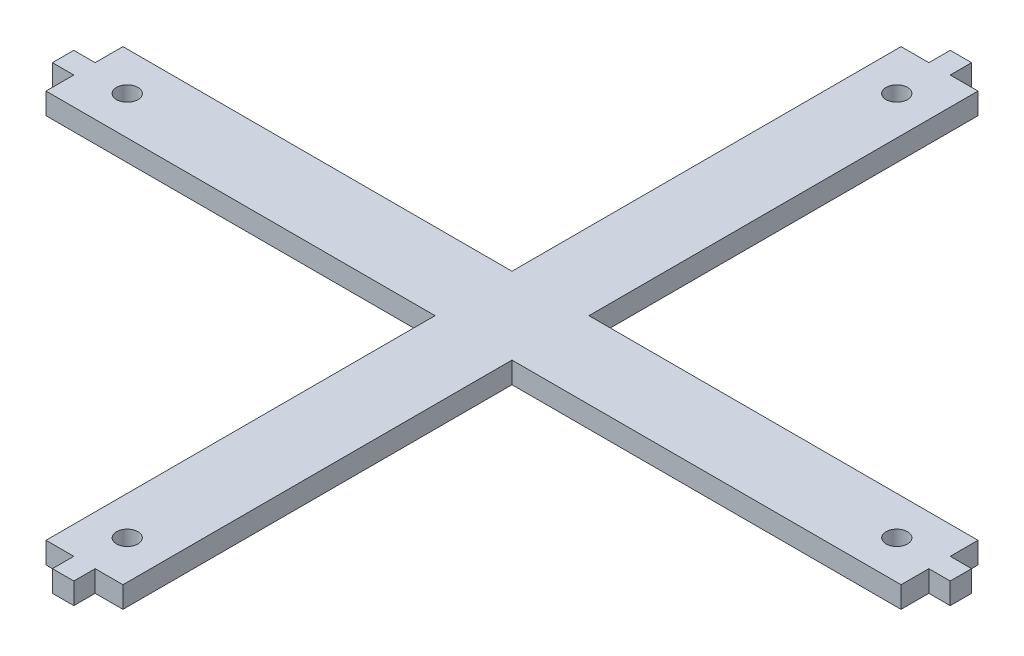
ISO-10303-21;
HEADER;
FILE_DESCRIPTION(('STEP AP214'),'2;1');
FILE_NAME('part.step','',(''),(''),'','','');
FILE_SCHEMA(('AUTOMOTIVE_DESIGN { 1 0 10303 214 1 1 1 1 }'));
ENDSEC;
DATA;
#1=APPLICATION_CONTEXT('core data for automotive mechanical design processes');
#2=APPLICATION_PROTOCOL_DEFINITION('international standard','automotive_design',2000,#1);
#3=PRODUCT_CONTEXT('',#1,'mechanical');
#4=PRODUCT('Part','Part','',(#3));
#5=PRODUCT_RELATED_PRODUCT_CATEGORY('part','',(#4));
#6=PRODUCT_DEFINITION_FORMATION('','',#4);
#7=PRODUCT_DEFINITION_CONTEXT('part definition',#1,'design');
#8=PRODUCT_DEFINITION('design','',#6,#7);
#9=PRODUCT_DEFINITION_SHAPE('','',#8);
#10=(LENGTH_UNIT() NAMED_UNIT(*) SI_UNIT(.MILLI.,.METRE.));
#11=(NAMED_UNIT(*) PLANE_ANGLE_UNIT() SI_UNIT($,.RADIAN.));
#12=(NAMED_UNIT(*) SI_UNIT($,.STERADIAN.) SOLID_ANGLE_UNIT());
#13=UNCERTAINTY_MEASURE_WITH_UNIT(LENGTH_MEASURE(1.E-05),#10,'distance_accuracy_value','');
#14=(GEOMETRIC_REPRESENTATION_CONTEXT(3) GLOBAL_UNCERTAINTY_ASSIGNED_CONTEXT((#13)) GLOBAL_UNIT_ASSIGNED_CONTEXT((#10,
#11,#12)) REPRESENTATION_CONTEXT('',''));
#15=CARTESIAN_POINT('',(0.,0.,0.));
#16=DIRECTION('',(0.,0.,1.));
#17=DIRECTION('',(1.,0.,0.));
#18=AXIS2_PLACEMENT_3D('',#15,#16,#17);
#19=CARTESIAN_POINT('',(0.,6.35,0.));
#20=DIRECTION('',(0.,1.,0.));
#21=DIRECTION('',(0.,0.,1.));
#22=AXIS2_PLACEMENT_3D('',#19,#20,#21);
#23=PLANE('',#22);
#24=CARTESIAN_POINT('',(0.,6.35,-114.3));
#25=DIRECTION('',(0.,1.,0.));
#26=DIRECTION('',(0.,0.,1.));
#27=AXIS2_PLACEMENT_3D('',#24,#25,#26);
#28=CIRCLE('',#27,3.175);
#29=CARTESIAN_POINT('',(0.,6.35,-111.125));
#30=VERTEX_POINT('',#29);
#31=EDGE_CURVE('E501',#30,#30,#28,.T.);
#32=ORIENTED_EDGE('',*,*,#31,.F.);
#33=EDGE_LOOP('',(#32));
#34=FACE_BOUND('',#33,.T.);
#35=CARTESIAN_POINT('',(-114.3,6.35,0.));
#36=DIRECTION('',(0.,1.,0.));
#37=DIRECTION('',(0.,0.,1.));
#38=AXIS2_PLACEMENT_3D('',#35,#36,#37);
#39=CIRCLE('',#38,3.175);
#40=CARTESIAN_POINT('',(-114.3,6.35,3.175));
#41=VERTEX_POINT('',#40);
#42=EDGE_CURVE('E256',#41,#41,#39,.T.);
#43=ORIENTED_EDGE('',*,*,#42,.F.);
#44=EDGE_LOOP('',(#43));
#45=FACE_BOUND('',#44,.T.);
#46=DIRECTION('',(0.,0.,-1.));
#47=VECTOR('',#46,1.);
#48=CARTESIAN_POINT('',(127.,6.35,3.175));
#49=LINE('',#48,#47);
#50=CARTESIAN_POINT('',(127.,6.35,11.43));
#51=VERTEX_POINT('',#50);
#52=CARTESIAN_POINT('',(127.,6.35,3.175));
#53=VERTEX_POINT('',#52);
#54=EDGE_CURVE('E307',#51,#53,#49,.T.);
#55=ORIENTED_EDGE('',*,*,#54,.T.);
#56=DIRECTION('',(1.,0.,0.));
#57=VECTOR('',#56,1.);
#58=CARTESIAN_POINT('',(127.,6.35,3.175));
#59=LINE('',#58,#57);
#60=CARTESIAN_POINT('',(133.35,6.35,3.175));
#61=VERTEX_POINT('',#60);
#62=EDGE_CURVE('E155',#53,#61,#59,.T.);
#63=ORIENTED_EDGE('',*,*,#62,.T.);
#64=DIRECTION('',(0.,0.,-1.));
#65=VECTOR('',#64,1.);
#66=CARTESIAN_POINT('',(133.35,6.35,-3.175));
#67=LINE('',#66,#65);
#68=CARTESIAN_POINT('',(133.35,6.35,-3.175));
#69=VERTEX_POINT('',#68);
#70=EDGE_CURVE('E382',#61,#69,#67,.T.);
#71=ORIENTED_EDGE('',*,*,#70,.T.);
#72=DIRECTION('',(-1.,0.,0.));
#73=VECTOR('',#72,1.);
#74=CARTESIAN_POINT('',(127.,6.35,-3.175));
#75=LINE('',#74,#73);
#76=CARTESIAN_POINT('',(127.,6.35,-3.175));
#77=VERTEX_POINT('',#76);
#78=EDGE_CURVE('E401',#69,#77,#75,.T.);
#79=ORIENTED_EDGE('',*,*,#78,.T.);
#80=DIRECTION('',(0.,0.,-1.));
#81=VECTOR('',#80,1.);
#82=CARTESIAN_POINT('',(127.,6.35,-11.43));
#83=LINE('',#82,#81);
#84=CARTESIAN_POINT('',(127.,6.35,-11.43));
#85=VERTEX_POINT('',#84);
#86=EDGE_CURVE('E398',#77,#85,#83,.T.);
#87=ORIENTED_EDGE('',*,*,#86,.T.);
#88=DIRECTION('',(-1.,0.,0.));
#89=VECTOR('',#88,1.);
#90=CARTESIAN_POINT('',(11.43,6.35,-11.43));
#91=LINE('',#90,#89);
#92=CARTESIAN_POINT('',(11.43,6.35,-11.43));
#93=VERTEX_POINT('',#92);
#94=EDGE_CURVE('E400',#85,#93,#91,.T.);
#95=ORIENTED_EDGE('',*,*,#94,.T.);
#96=DIRECTION('',(0.,0.,-1.));
#97=VECTOR('',#96,1.);
#98=CARTESIAN_POINT('',(11.43,6.35,-127.));
#99=LINE('',#98,#97);
#100=CARTESIAN_POINT('',(11.43,6.35,-127.));
#101=VERTEX_POINT('',#100);
#102=EDGE_CURVE('E403',#93,#101,#99,.T.);
#103=ORIENTED_EDGE('',*,*,#102,.T.);
#104=DIRECTION('',(-1.,0.,0.));
#105=VECTOR('',#104,1.);
#106=CARTESIAN_POINT('',(3.17499999999998,6.35,-127.));
#107=LINE('',#106,#105);
#108=CARTESIAN_POINT('',(3.17499999999998,6.35,-127.));
#109=VERTEX_POINT('',#108);
#110=EDGE_CURVE('E409',#101,#109,#107,.T.);
#111=ORIENTED_EDGE('',*,*,#110,.T.);
#112=DIRECTION('',(0.,0.,-1.));
#113=VECTOR('',#112,1.);
#114=CARTESIAN_POINT('',(3.17499999999998,6.35,-127.));
#115=LINE('',#114,#113);
#116=CARTESIAN_POINT('',(3.17499999999998,6.35,-133.35));
#117=VERTEX_POINT('',#116);
#118=EDGE_CURVE('E411',#109,#117,#115,.T.);
#119=ORIENTED_EDGE('',*,*,#118,.T.);
#120=DIRECTION('',(-1.,0.,0.));
#121=VECTOR('',#120,1.);
#122=CARTESIAN_POINT('',(-3.17500000000002,6.35,-133.35));
#123=LINE('',#122,#121);
#124=CARTESIAN_POINT('',(-3.17500000000002,6.35,-133.35));
#125=VERTEX_POINT('',#124);
#126=EDGE_CURVE('E413',#117,#125,#123,.T.);
#127=ORIENTED_EDGE('',*,*,#126,.T.);
#128=DIRECTION('',(0.,0.,1.));
#129=VECTOR('',#128,1.);
#130=CARTESIAN_POINT('',(-3.17500000000002,6.35,-127.));
#131=LINE('',#130,#129);
#132=CARTESIAN_POINT('',(-3.17500000000002,6.35,-127.));
#133=VERTEX_POINT('',#132);
#134=EDGE_CURVE('E415',#125,#133,#131,.T.);
#135=ORIENTED_EDGE('',*,*,#134,.T.);
#136=DIRECTION('',(-1.,0.,0.));
#137=VECTOR('',#136,1.);
#138=CARTESIAN_POINT('',(-11.43,6.35,-127.));
#139=LINE('',#138,#137);
#140=CARTESIAN_POINT('',(-11.43,6.35,-127.));
#141=VERTEX_POINT('',#140);
#142=EDGE_CURVE('E417',#133,#141,#139,.T.);
#143=ORIENTED_EDGE('',*,*,#142,.T.);
#144=DIRECTION('',(0.,0.,1.));
#145=VECTOR('',#144,1.);
#146=CARTESIAN_POINT('',(-11.43,6.35,-127.));
#147=LINE('',#146,#145);
#148=CARTESIAN_POINT('',(-11.43,6.35,-11.43));
#149=VERTEX_POINT('',#148);
#150=EDGE_CURVE('E419',#141,#149,#147,.T.);
#151=ORIENTED_EDGE('',*,*,#150,.T.);
#152=DIRECTION('',(-1.,0.,0.));
#153=VECTOR('',#152,1.);
#154=CARTESIAN_POINT('',(-127.,6.35,-11.43));
#155=LINE('',#154,#153);
#156=CARTESIAN_POINT('',(-127.,6.35,-11.43));
#157=VERTEX_POINT('',#156);
#158=EDGE_CURVE('E421',#149,#157,#155,.T.);
#159=ORIENTED_EDGE('',*,*,#158,.T.);
#160=DIRECTION('',(0.,0.,1.));
#161=VECTOR('',#160,1.);
#162=CARTESIAN_POINT('',(-127.,6.35,-11.43));
#163=LINE('',#162,#161);
#164=CARTESIAN_POINT('',(-127.,6.35,-3.175));
#165=VERTEX_POINT('',#164);
#166=EDGE_CURVE('E423',#157,#165,#163,.T.);
#167=ORIENTED_EDGE('',*,*,#166,.T.);
#168=DIRECTION('',(-1.,0.,0.));
#169=VECTOR('',#168,1.);
#170=CARTESIAN_POINT('',(-133.35,6.35,-3.175));
#171=LINE('',#170,#169);
#172=CARTESIAN_POINT('',(-133.35,6.35,-3.175));
#173=VERTEX_POINT('',#172);
#174=EDGE_CURVE('E425',#165,#173,#171,.T.);
#175=ORIENTED_EDGE('',*,*,#174,.T.);
#176=DIRECTION('',(0.,0.,1.));
#177=VECTOR('',#176,1.);
#178=CARTESIAN_POINT('',(-133.35,6.35,-3.175));
#179=LINE('',#178,#177);
#180=CARTESIAN_POINT('',(-133.35,6.35,3.175));
#181=VERTEX_POINT('',#180);
#182=EDGE_CURVE('E427',#173,#181,#179,.T.);
#183=ORIENTED_EDGE('',*,*,#182,.T.);
#184=DIRECTION('',(1.,0.,0.));
#185=VECTOR('',#184,1.);
#186=CARTESIAN_POINT('',(-133.35,6.35,3.175));
#187=LINE('',#186,#185);
#188=CARTESIAN_POINT('',(-127.,6.35,3.175));
#189=VERTEX_POINT('',#188);
#190=EDGE_CURVE('E429',#181,#189,#187,.T.);
#191=ORIENTED_EDGE('',*,*,#190,.T.);
#192=DIRECTION('',(0.,0.,1.));
#193=VECTOR('',#192,1.);
#194=CARTESIAN_POINT('',(-127.,6.35,3.175));
#195=LINE('',#194,#193);
#196=CARTESIAN_POINT('',(-127.,6.35,11.43));
#197=VERTEX_POINT('',#196);
#198=EDGE_CURVE('E431',#189,#197,#195,.T.);
#199=ORIENTED_EDGE('',*,*,#198,.T.);
#200=DIRECTION('',(1.,0.,0.));
#201=VECTOR('',#200,1.);
#202=CARTESIAN_POINT('',(-127.,6.35,11.43));
#203=LINE('',#202,#201);
#204=CARTESIAN_POINT('',(-11.43,6.35,11.43));
#205=VERTEX_POINT('',#204);
#206=EDGE_CURVE('E433',#197,#205,#203,.T.);
#207=ORIENTED_EDGE('',*,*,#206,.T.);
#208=DIRECTION('',(0.,0.,1.));
#209=VECTOR('',#208,1.);
#210=CARTESIAN_POINT('',(-11.43,6.35,11.43));
#211=LINE('',#210,#209);
#212=CARTESIAN_POINT('',(-11.43,6.35,127.));
#213=VERTEX_POINT('',#212);
#214=EDGE_CURVE('E435',#205,#213,#211,.T.);
#215=ORIENTED_EDGE('',*,*,#214,.T.);
#216=DIRECTION('',(1.,0.,0.));
#217=VECTOR('',#216,1.);
#218=CARTESIAN_POINT('',(-11.43,6.35,127.));
#219=LINE('',#218,#217);
#220=CARTESIAN_POINT('',(-3.17499999999995,6.35,127.));
#221=VERTEX_POINT('',#220);
#222=EDGE_CURVE('E437',#213,#221,#219,.T.);
#223=ORIENTED_EDGE('',*,*,#222,.T.);
#224=DIRECTION('',(0.,0.,1.));
#225=VECTOR('',#224,1.);
#226=CARTESIAN_POINT('',(-3.17499999999995,6.35,127.));
#227=LINE('',#226,#225);
#228=CARTESIAN_POINT('',(-3.17499999999995,6.35,133.35));
#229=VERTEX_POINT('',#228);
#230=EDGE_CURVE('E439',#221,#229,#227,.T.);
#231=ORIENTED_EDGE('',*,*,#230,.T.);
#232=DIRECTION('',(1.,0.,0.));
#233=VECTOR('',#232,1.);
#234=CARTESIAN_POINT('',(-3.17499999999995,6.35,133.35));
#235=LINE('',#234,#233);
#236=CARTESIAN_POINT('',(3.17500000000005,6.35,133.35));
#237=VERTEX_POINT('',#236);
#238=EDGE_CURVE('E441',#229,#237,#235,.T.);
#239=ORIENTED_EDGE('',*,*,#238,.T.);
#240=DIRECTION('',(0.,0.,-1.));
#241=VECTOR('',#240,1.);
#242=CARTESIAN_POINT('',(3.17500000000005,6.35,127.));
#243=LINE('',#242,#241);
#244=CARTESIAN_POINT('',(3.17500000000005,6.35,127.));
#245=VERTEX_POINT('',#244);
#246=EDGE_CURVE('E234',#237,#245,#243,.T.);
#247=ORIENTED_EDGE('',*,*,#246,.T.);
#248=DIRECTION('',(1.,0.,0.));
#249=VECTOR('',#248,1.);
#250=CARTESIAN_POINT('',(3.17500000000005,6.35,127.));
#251=LINE('',#250,#249);
#252=CARTESIAN_POINT('',(11.43,6.35,127.));
#253=VERTEX_POINT('',#252);
#254=EDGE_CURVE('E228',#245,#253,#251,.T.);
#255=ORIENTED_EDGE('',*,*,#254,.T.);
#256=DIRECTION('',(0.,0.,-1.));
#257=VECTOR('',#256,1.);
#258=CARTESIAN_POINT('',(11.43,6.35,11.43));
#259=LINE('',#258,#257);
#260=CARTESIAN_POINT('',(11.43,6.35,11.43));
#261=VERTEX_POINT('',#260);
#262=EDGE_CURVE('E232',#253,#261,#259,.T.);
#263=ORIENTED_EDGE('',*,*,#262,.T.);
#264=DIRECTION('',(1.,0.,0.));
#265=VECTOR('',#264,1.);
#266=CARTESIAN_POINT('',(11.43,6.35,11.43));
#267=LINE('',#266,#265);
#268=EDGE_CURVE('E52',#261,#51,#267,.T.);
#269=ORIENTED_EDGE('',*,*,#268,.T.);
#270=EDGE_LOOP('',(#55,#63,#71,#79,#87,#95,#103,#111,#119,#127,#135,#143,#151,#159,#167,#175,
#183,#191,#199,#207,#215,#223,#231,#239,#247,#255,#263,#269));
#271=FACE_BOUND('',#270,.T.);
#272=CARTESIAN_POINT('',(114.3,6.35,0.));
#273=DIRECTION('',(0.,1.,0.));
#274=DIRECTION('',(0.,0.,1.));
#275=AXIS2_PLACEMENT_3D('',#272,#273,#274);
#276=CIRCLE('',#275,3.175);
#277=CARTESIAN_POINT('',(114.3,6.35,3.17499999999999));
#278=VERTEX_POINT('',#277);
#279=EDGE_CURVE('E507',#278,#278,#276,.T.);
#280=ORIENTED_EDGE('',*,*,#279,.F.);
#281=EDGE_LOOP('',(#280));
#282=FACE_BOUND('',#281,.T.);
#283=CARTESIAN_POINT('',(0.,6.35,114.3));
#284=DIRECTION('',(0.,1.,0.));
#285=DIRECTION('',(0.,0.,1.));
#286=AXIS2_PLACEMENT_3D('',#283,#284,#285);
#287=CIRCLE('',#286,3.175);
#288=CARTESIAN_POINT('',(0.,6.35,117.475));
#289=VERTEX_POINT('',#288);
#290=EDGE_CURVE('E492',#289,#289,#287,.T.);
#291=ORIENTED_EDGE('',*,*,#290,.F.);
#292=EDGE_LOOP('',(#291));
#293=FACE_BOUND('',#292,.T.);
#294=ADVANCED_FACE('F35',(#34,#45,#271,#282,#293),#23,.T.);
#295=CARTESIAN_POINT('',(0.,0.,0.));
#296=DIRECTION('',(0.,1.,0.));
#297=DIRECTION('',(0.,0.,1.));
#298=AXIS2_PLACEMENT_3D('',#295,#296,#297);
#299=PLANE('',#298);
#300=DIRECTION('',(0.,0.,-1.));
#301=VECTOR('',#300,1.);
#302=CARTESIAN_POINT('',(127.,0.,3.175));
#303=LINE('',#302,#301);
#304=CARTESIAN_POINT('',(127.,0.,11.43));
#305=VERTEX_POINT('',#304);
#306=CARTESIAN_POINT('',(127.,0.,3.175));
#307=VERTEX_POINT('',#306);
#308=EDGE_CURVE('E252',#305,#307,#303,.T.);
#309=ORIENTED_EDGE('',*,*,#308,.F.);
#310=DIRECTION('',(1.,0.,0.));
#311=VECTOR('',#310,1.);
#312=CARTESIAN_POINT('',(11.43,0.,11.43));
#313=LINE('',#312,#311);
#314=CARTESIAN_POINT('',(11.43,0.,11.43));
#315=VERTEX_POINT('',#314);
#316=EDGE_CURVE('E147',#315,#305,#313,.T.);
#317=ORIENTED_EDGE('',*,*,#316,.F.);
#318=DIRECTION('',(0.,0.,-1.));
#319=VECTOR('',#318,1.);
#320=CARTESIAN_POINT('',(11.43,0.,11.43));
#321=LINE('',#320,#319);
#322=CARTESIAN_POINT('',(11.43,0.,127.));
#323=VERTEX_POINT('',#322);
#324=EDGE_CURVE('E141',#323,#315,#321,.T.);
#325=ORIENTED_EDGE('',*,*,#324,.F.);
#326=DIRECTION('',(1.,0.,0.));
#327=VECTOR('',#326,1.);
#328=CARTESIAN_POINT('',(3.17500000000005,0.,127.));
#329=LINE('',#328,#327);
#330=CARTESIAN_POINT('',(3.17500000000005,0.,127.));
#331=VERTEX_POINT('',#330);
#332=EDGE_CURVE('E242',#331,#323,#329,.T.);
#333=ORIENTED_EDGE('',*,*,#332,.F.);
#334=DIRECTION('',(0.,0.,-1.));
#335=VECTOR('',#334,1.);
#336=CARTESIAN_POINT('',(3.17500000000005,0.,127.));
#337=LINE('',#336,#335);
#338=CARTESIAN_POINT('',(3.17500000000005,0.,133.35));
#339=VERTEX_POINT('',#338);
#340=EDGE_CURVE('E302',#339,#331,#337,.T.);
#341=ORIENTED_EDGE('',*,*,#340,.F.);
#342=DIRECTION('',(1.,0.,0.));
#343=VECTOR('',#342,1.);
#344=CARTESIAN_POINT('',(-3.17499999999995,0.,133.35));
#345=LINE('',#344,#343);
#346=CARTESIAN_POINT('',(-3.17499999999995,0.,133.35));
#347=VERTEX_POINT('',#346);
#348=EDGE_CURVE('E300',#347,#339,#345,.T.);
#349=ORIENTED_EDGE('',*,*,#348,.F.);
#350=DIRECTION('',(0.,0.,1.));
#351=VECTOR('',#350,1.);
#352=CARTESIAN_POINT('',(-3.17499999999995,0.,127.));
#353=LINE('',#352,#351);
#354=CARTESIAN_POINT('',(-3.17499999999995,0.,127.));
#355=VERTEX_POINT('',#354);
#356=EDGE_CURVE('E298',#355,#347,#353,.T.);
#357=ORIENTED_EDGE('',*,*,#356,.F.);
#358=DIRECTION('',(1.,0.,0.));
#359=VECTOR('',#358,1.);
#360=CARTESIAN_POINT('',(-11.43,0.,127.));
#361=LINE('',#360,#359);
#362=CARTESIAN_POINT('',(-11.43,0.,127.));
#363=VERTEX_POINT('',#362);
#364=EDGE_CURVE('E296',#363,#355,#361,.T.);
#365=ORIENTED_EDGE('',*,*,#364,.F.);
#366=DIRECTION('',(0.,0.,1.));
#367=VECTOR('',#366,1.);
#368=CARTESIAN_POINT('',(-11.43,0.,11.43));
#369=LINE('',#368,#367);
#370=CARTESIAN_POINT('',(-11.43,0.,11.43));
#371=VERTEX_POINT('',#370);
#372=EDGE_CURVE('E294',#371,#363,#369,.T.);
#373=ORIENTED_EDGE('',*,*,#372,.F.);
#374=DIRECTION('',(1.,0.,0.));
#375=VECTOR('',#374,1.);
#376=CARTESIAN_POINT('',(-127.,0.,11.43));
#377=LINE('',#376,#375);
#378=CARTESIAN_POINT('',(-127.,0.,11.43));
#379=VERTEX_POINT('',#378);
#380=EDGE_CURVE('E292',#379,#371,#377,.T.);
#381=ORIENTED_EDGE('',*,*,#380,.F.);
#382=DIRECTION('',(0.,0.,1.));
#383=VECTOR('',#382,1.);
#384=CARTESIAN_POINT('',(-127.,0.,3.175));
#385=LINE('',#384,#383);
#386=CARTESIAN_POINT('',(-127.,0.,3.175));
#387=VERTEX_POINT('',#386);
#388=EDGE_CURVE('E290',#387,#379,#385,.T.);
#389=ORIENTED_EDGE('',*,*,#388,.F.);
#390=DIRECTION('',(1.,0.,0.));
#391=VECTOR('',#390,1.);
#392=CARTESIAN_POINT('',(-133.35,0.,3.175));
#393=LINE('',#392,#391);
#394=CARTESIAN_POINT('',(-133.35,0.,3.175));
#395=VERTEX_POINT('',#394);
#396=EDGE_CURVE('E288',#395,#387,#393,.T.);
#397=ORIENTED_EDGE('',*,*,#396,.F.);
#398=DIRECTION('',(0.,0.,1.));
#399=VECTOR('',#398,1.);
#400=CARTESIAN_POINT('',(-133.35,0.,-3.175));
#401=LINE('',#400,#399);
#402=CARTESIAN_POINT('',(-133.35,0.,-3.175));
#403=VERTEX_POINT('',#402);
#404=EDGE_CURVE('E286',#403,#395,#401,.T.);
#405=ORIENTED_EDGE('',*,*,#404,.F.);
#406=DIRECTION('',(-1.,0.,0.));
#407=VECTOR('',#406,1.);
#408=CARTESIAN_POINT('',(-133.35,0.,-3.175));
#409=LINE('',#408,#407);
#410=CARTESIAN_POINT('',(-127.,0.,-3.175));
#411=VERTEX_POINT('',#410);
#412=EDGE_CURVE('E284',#411,#403,#409,.T.);
#413=ORIENTED_EDGE('',*,*,#412,.F.);
#414=DIRECTION('',(0.,0.,1.));
#415=VECTOR('',#414,1.);
#416=CARTESIAN_POINT('',(-127.,0.,-11.43));
#417=LINE('',#416,#415);
#418=CARTESIAN_POINT('',(-127.,0.,-11.43));
#419=VERTEX_POINT('',#418);
#420=EDGE_CURVE('E282',#419,#411,#417,.T.);
#421=ORIENTED_EDGE('',*,*,#420,.F.);
#422=DIRECTION('',(-1.,0.,0.));
#423=VECTOR('',#422,1.);
#424=CARTESIAN_POINT('',(-127.,0.,-11.43));
#425=LINE('',#424,#423);
#426=CARTESIAN_POINT('',(-11.43,0.,-11.43));
#427=VERTEX_POINT('',#426);
#428=EDGE_CURVE('E280',#427,#419,#425,.T.);
#429=ORIENTED_EDGE('',*,*,#428,.F.);
#430=DIRECTION('',(0.,0.,1.));
#431=VECTOR('',#430,1.);
#432=CARTESIAN_POINT('',(-11.43,0.,-127.));
#433=LINE('',#432,#431);
#434=CARTESIAN_POINT('',(-11.43,0.,-127.));
#435=VERTEX_POINT('',#434);
#436=EDGE_CURVE('E278',#435,#427,#433,.T.);
#437=ORIENTED_EDGE('',*,*,#436,.F.);
#438=DIRECTION('',(-1.,0.,0.));
#439=VECTOR('',#438,1.);
#440=CARTESIAN_POINT('',(-11.43,0.,-127.));
#441=LINE('',#440,#439);
#442=CARTESIAN_POINT('',(-3.17500000000002,0.,-127.));
#443=VERTEX_POINT('',#442);
#444=EDGE_CURVE('E276',#443,#435,#441,.T.);
#445=ORIENTED_EDGE('',*,*,#444,.F.);
#446=DIRECTION('',(0.,0.,1.));
#447=VECTOR('',#446,1.);
#448=CARTESIAN_POINT('',(-3.17500000000002,0.,-127.));
#449=LINE('',#448,#447);
#450=CARTESIAN_POINT('',(-3.17500000000002,0.,-133.35));
#451=VERTEX_POINT('',#450);
#452=EDGE_CURVE('E274',#451,#443,#449,.T.);
#453=ORIENTED_EDGE('',*,*,#452,.F.);
#454=DIRECTION('',(-1.,0.,0.));
#455=VECTOR('',#454,1.);
#456=CARTESIAN_POINT('',(-3.17500000000002,0.,-133.35));
#457=LINE('',#456,#455);
#458=CARTESIAN_POINT('',(3.17499999999998,0.,-133.35));
#459=VERTEX_POINT('',#458);
#460=EDGE_CURVE('E272',#459,#451,#457,.T.);
#461=ORIENTED_EDGE('',*,*,#460,.F.);
#462=DIRECTION('',(0.,0.,-1.));
#463=VECTOR('',#462,1.);
#464=CARTESIAN_POINT('',(3.17499999999998,0.,-127.));
#465=LINE('',#464,#463);
#466=CARTESIAN_POINT('',(3.17499999999998,0.,-127.));
#467=VERTEX_POINT('',#466);
#468=EDGE_CURVE('E270',#467,#459,#465,.T.);
#469=ORIENTED_EDGE('',*,*,#468,.F.);
#470=DIRECTION('',(-1.,0.,0.));
#471=VECTOR('',#470,1.);
#472=CARTESIAN_POINT('',(3.17499999999998,0.,-127.));
#473=LINE('',#472,#471);
#474=CARTESIAN_POINT('',(11.43,0.,-127.));
#475=VERTEX_POINT('',#474);
#476=EDGE_CURVE('E268',#475,#467,#473,.T.);
#477=ORIENTED_EDGE('',*,*,#476,.F.);
#478=DIRECTION('',(0.,0.,-1.));
#479=VECTOR('',#478,1.);
#480=CARTESIAN_POINT('',(11.43,0.,-127.));
#481=LINE('',#480,#479);
#482=CARTESIAN_POINT('',(11.43,0.,-11.43));
#483=VERTEX_POINT('',#482);
#484=EDGE_CURVE('E266',#483,#475,#481,.T.);
#485=ORIENTED_EDGE('',*,*,#484,.F.);
#486=DIRECTION('',(-1.,0.,0.));
#487=VECTOR('',#486,1.);
#488=CARTESIAN_POINT('',(11.43,0.,-11.43));
#489=LINE('',#488,#487);
#490=CARTESIAN_POINT('',(127.,0.,-11.43));
#491=VERTEX_POINT('',#490);
#492=EDGE_CURVE('E264',#491,#483,#489,.T.);
#493=ORIENTED_EDGE('',*,*,#492,.F.);
#494=DIRECTION('',(0.,0.,-1.));
#495=VECTOR('',#494,1.);
#496=CARTESIAN_POINT('',(127.,0.,-11.43));
#497=LINE('',#496,#495);
#498=CARTESIAN_POINT('',(127.,0.,-3.175));
#499=VERTEX_POINT('',#498);
#500=EDGE_CURVE('E262',#499,#491,#497,.T.);
#501=ORIENTED_EDGE('',*,*,#500,.F.);
#502=DIRECTION('',(-1.,0.,0.));
#503=VECTOR('',#502,1.);
#504=CARTESIAN_POINT('',(127.,0.,-3.175));
#505=LINE('',#504,#503);
#506=CARTESIAN_POINT('',(133.35,0.,-3.175));
#507=VERTEX_POINT('',#506);
#508=EDGE_CURVE('E260',#507,#499,#505,.T.);
#509=ORIENTED_EDGE('',*,*,#508,.F.);
#510=DIRECTION('',(0.,0.,-1.));
#511=VECTOR('',#510,1.);
#512=CARTESIAN_POINT('',(133.35,0.,-3.175));
#513=LINE('',#512,#511);
#514=CARTESIAN_POINT('',(133.35,0.,3.175));
#515=VERTEX_POINT('',#514);
#516=EDGE_CURVE('E258',#515,#507,#513,.T.);
#517=ORIENTED_EDGE('',*,*,#516,.F.);
#518=DIRECTION('',(1.,0.,0.));
#519=VECTOR('',#518,1.);
#520=CARTESIAN_POINT('',(127.,0.,3.175));
#521=LINE('',#520,#519);
#522=EDGE_CURVE('E255',#307,#515,#521,.T.);
#523=ORIENTED_EDGE('',*,*,#522,.F.);
#524=EDGE_LOOP('',(#309,#317,#325,#333,#341,#349,#357,#365,#373,#381,#389,#397,#405,#413,#421,
#429,#437,#445,#453,#461,#469,#477,#485,#493,#501,#509,#517,#523));
#525=FACE_BOUND('',#524,.T.);
#526=CARTESIAN_POINT('',(-114.3,0.,0.));
#527=DIRECTION('',(0.,1.,0.));
#528=DIRECTION('',(0.,0.,1.));
#529=AXIS2_PLACEMENT_3D('',#526,#527,#528);
#530=CIRCLE('',#529,3.175);
#531=CARTESIAN_POINT('',(-114.3,0.,3.175));
#532=VERTEX_POINT('',#531);
#533=EDGE_CURVE('E510',#532,#532,#530,.T.);
#534=ORIENTED_EDGE('',*,*,#533,.T.);
#535=EDGE_LOOP('',(#534));
#536=FACE_BOUND('',#535,.T.);
#537=CARTESIAN_POINT('',(114.3,0.,0.));
#538=DIRECTION('',(0.,1.,0.));
#539=DIRECTION('',(0.,0.,1.));
#540=AXIS2_PLACEMENT_3D('',#537,#538,#539);
#541=CIRCLE('',#540,3.175);
#542=CARTESIAN_POINT('',(114.3,0.,3.17499999999999));
#543=VERTEX_POINT('',#542);
#544=EDGE_CURVE('E504',#543,#543,#541,.T.);
#545=ORIENTED_EDGE('',*,*,#544,.T.);
#546=EDGE_LOOP('',(#545));
#547=FACE_BOUND('',#546,.T.);
#548=CARTESIAN_POINT('',(0.,0.,-114.3));
#549=DIRECTION('',(0.,1.,0.));
#550=DIRECTION('',(0.,0.,1.));
#551=AXIS2_PLACEMENT_3D('',#548,#549,#550);
#552=CIRCLE('',#551,3.175);
#553=CARTESIAN_POINT('',(0.,0.,-111.125));
#554=VERTEX_POINT('',#553);
#555=EDGE_CURVE('E498',#554,#554,#552,.T.);
#556=ORIENTED_EDGE('',*,*,#555,.T.);
#557=EDGE_LOOP('',(#556));
#558=FACE_BOUND('',#557,.T.);
#559=CARTESIAN_POINT('',(0.,0.,114.3));
#560=DIRECTION('',(0.,1.,0.));
#561=DIRECTION('',(0.,0.,1.));
#562=AXIS2_PLACEMENT_3D('',#559,#560,#561);
#563=CIRCLE('',#562,3.175);
#564=CARTESIAN_POINT('',(0.,0.,117.475));
#565=VERTEX_POINT('',#564);
#566=EDGE_CURVE('E495',#565,#565,#563,.T.);
#567=ORIENTED_EDGE('',*,*,#566,.T.);
#568=EDGE_LOOP('',(#567));
#569=FACE_BOUND('',#568,.T.);
#570=ADVANCED_FACE('F386',(#525,#536,#547,#558,#569),#299,.F.);
#571=CARTESIAN_POINT('',(127.,6.35,3.175));
#572=DIRECTION('',(-1.,0.,0.));
#573=DIRECTION('',(0.,0.,1.));
#574=AXIS2_PLACEMENT_3D('',#571,#572,#573);
#575=PLANE('',#574);
#576=ORIENTED_EDGE('',*,*,#308,.T.);
#577=DIRECTION('',(0.,-1.,0.));
#578=VECTOR('',#577,1.);
#579=CARTESIAN_POINT('',(127.,6.35,3.175));
#580=LINE('',#579,#578);
#581=EDGE_CURVE('E11',#53,#307,#580,.T.);
#582=ORIENTED_EDGE('',*,*,#581,.F.);
#583=ORIENTED_EDGE('',*,*,#54,.F.);
#584=DIRECTION('',(0.,-1.,0.));
#585=VECTOR('',#584,1.);
#586=CARTESIAN_POINT('',(127.,6.35,11.43));
#587=LINE('',#586,#585);
#588=EDGE_CURVE('E248',#51,#305,#587,.T.);
#589=ORIENTED_EDGE('',*,*,#588,.T.);
#590=EDGE_LOOP('',(#576,#582,#583,#589));
#591=FACE_BOUND('',#590,.T.);
#592=ADVANCED_FACE('F37',(#591),#575,.F.);
#593=CARTESIAN_POINT('',(127.,6.35,3.175));
#594=DIRECTION('',(0.,0.,-1.));
#595=DIRECTION('',(-1.,0.,0.));
#596=AXIS2_PLACEMENT_3D('',#593,#594,#595);
#597=PLANE('',#596);
#598=ORIENTED_EDGE('',*,*,#522,.T.);
#599=DIRECTION('',(0.,-1.,0.));
#600=VECTOR('',#599,1.);
#601=CARTESIAN_POINT('',(133.35,6.35,3.175));
#602=LINE('',#601,#600);
#603=EDGE_CURVE('E44',#61,#515,#602,.T.);
#604=ORIENTED_EDGE('',*,*,#603,.F.);
#605=ORIENTED_EDGE('',*,*,#62,.F.);
#606=ORIENTED_EDGE('',*,*,#581,.T.);
#607=EDGE_LOOP('',(#598,#604,#605,#606));
#608=FACE_BOUND('',#607,.T.);
#609=ADVANCED_FACE('F780',(#608),#597,.F.);
#610=CARTESIAN_POINT('',(133.35,6.35,-3.175));
#611=DIRECTION('',(-1.,0.,0.));
#612=DIRECTION('',(0.,0.,1.));
#613=AXIS2_PLACEMENT_3D('',#610,#611,#612);
#614=PLANE('',#613);
#615=ORIENTED_EDGE('',*,*,#516,.T.);
#616=DIRECTION('',(0.,-1.,0.));
#617=VECTOR('',#616,1.);
#618=CARTESIAN_POINT('',(133.35,6.35,-3.175));
#619=LINE('',#618,#617);
#620=EDGE_CURVE('E374',#69,#507,#619,.T.);
#621=ORIENTED_EDGE('',*,*,#620,.F.);
#622=ORIENTED_EDGE('',*,*,#70,.F.);
#623=ORIENTED_EDGE('',*,*,#603,.T.);
#624=EDGE_LOOP('',(#615,#621,#622,#623));
#625=FACE_BOUND('',#624,.T.);
#626=ADVANCED_FACE('F380',(#625),#614,.F.);
#627=CARTESIAN_POINT('',(127.,6.35,-3.175));
#628=DIRECTION('',(0.,0.,1.));
#629=DIRECTION('',(1.,0.,0.));
#630=AXIS2_PLACEMENT_3D('',#627,#628,#629);
#631=PLANE('',#630);
#632=ORIENTED_EDGE('',*,*,#508,.T.);
#633=DIRECTION('',(0.,-1.,0.));
#634=VECTOR('',#633,1.);
#635=CARTESIAN_POINT('',(127.,6.35,-3.175));
#636=LINE('',#635,#634);
#637=EDGE_CURVE('E371',#77,#499,#636,.T.);
#638=ORIENTED_EDGE('',*,*,#637,.F.);
#639=ORIENTED_EDGE('',*,*,#78,.F.);
#640=ORIENTED_EDGE('',*,*,#620,.T.);
#641=EDGE_LOOP('',(#632,#638,#639,#640));
#642=FACE_BOUND('',#641,.T.);
#643=ADVANCED_FACE('F392',(#642),#631,.F.);
#644=CARTESIAN_POINT('',(127.,6.35,-11.43));
#645=DIRECTION('',(-1.,0.,0.));
#646=DIRECTION('',(0.,0.,1.));
#647=AXIS2_PLACEMENT_3D('',#644,#645,#646);
#648=PLANE('',#647);
#649=ORIENTED_EDGE('',*,*,#500,.T.);
#650=DIRECTION('',(0.,-1.,0.));
#651=VECTOR('',#650,1.);
#652=CARTESIAN_POINT('',(127.,6.35,-11.43));
#653=LINE('',#652,#651);
#654=EDGE_CURVE('E368',#85,#491,#653,.T.);
#655=ORIENTED_EDGE('',*,*,#654,.F.);
#656=ORIENTED_EDGE('',*,*,#86,.F.);
#657=ORIENTED_EDGE('',*,*,#637,.T.);
#658=EDGE_LOOP('',(#649,#655,#656,#657));
#659=FACE_BOUND('',#658,.T.);
#660=ADVANCED_FACE('F396',(#659),#648,.F.);
#661=CARTESIAN_POINT('',(11.43,6.35,-11.43));
#662=DIRECTION('',(0.,0.,1.));
#663=DIRECTION('',(1.,0.,0.));
#664=AXIS2_PLACEMENT_3D('',#661,#662,#663);
#665=PLANE('',#664);
#666=ORIENTED_EDGE('',*,*,#492,.T.);
#667=DIRECTION('',(0.,-1.,0.));
#668=VECTOR('',#667,1.);
#669=CARTESIAN_POINT('',(11.43,6.35,-11.43));
#670=LINE('',#669,#668);
#671=EDGE_CURVE('E365',#93,#483,#670,.T.);
#672=ORIENTED_EDGE('',*,*,#671,.F.);
#673=ORIENTED_EDGE('',*,*,#94,.F.);
#674=ORIENTED_EDGE('',*,*,#654,.T.);
#675=EDGE_LOOP('',(#666,#672,#673,#674));
#676=FACE_BOUND('',#675,.T.);
#677=ADVANCED_FACE('F745',(#676),#665,.F.);
#678=CARTESIAN_POINT('',(11.43,6.35,-127.));
#679=DIRECTION('',(-1.,0.,0.));
#680=DIRECTION('',(0.,0.,1.));
#681=AXIS2_PLACEMENT_3D('',#678,#679,#680);
#682=PLANE('',#681);
#683=ORIENTED_EDGE('',*,*,#484,.T.);
#684=DIRECTION('',(0.,-1.,0.));
#685=VECTOR('',#684,1.);
#686=CARTESIAN_POINT('',(11.43,6.35,-127.));
#687=LINE('',#686,#685);
#688=EDGE_CURVE('E362',#101,#475,#687,.T.);
#689=ORIENTED_EDGE('',*,*,#688,.F.);
#690=ORIENTED_EDGE('',*,*,#102,.F.);
#691=ORIENTED_EDGE('',*,*,#671,.T.);
#692=EDGE_LOOP('',(#683,#689,#690,#691));
#693=FACE_BOUND('',#692,.T.);
#694=ADVANCED_FACE('F735',(#693),#682,.F.);
#695=CARTESIAN_POINT('',(3.17499999999998,6.35,-127.));
#696=DIRECTION('',(0.,0.,1.));
#697=DIRECTION('',(1.,0.,0.));
#698=AXIS2_PLACEMENT_3D('',#695,#696,#697);
#699=PLANE('',#698);
#700=ORIENTED_EDGE('',*,*,#476,.T.);
#701=DIRECTION('',(0.,-1.,0.));
#702=VECTOR('',#701,1.);
#703=CARTESIAN_POINT('',(3.17499999999998,6.35,-127.));
#704=LINE('',#703,#702);
#705=EDGE_CURVE('E359',#109,#467,#704,.T.);
#706=ORIENTED_EDGE('',*,*,#705,.F.);
#707=ORIENTED_EDGE('',*,*,#110,.F.);
#708=ORIENTED_EDGE('',*,*,#688,.T.);
#709=EDGE_LOOP('',(#700,#706,#707,#708));
#710=FACE_BOUND('',#709,.T.);
#711=ADVANCED_FACE('F725',(#710),#699,.F.);
#712=CARTESIAN_POINT('',(3.17499999999998,6.35,-127.));
#713=DIRECTION('',(-1.,0.,0.));
#714=DIRECTION('',(0.,0.,1.));
#715=AXIS2_PLACEMENT_3D('',#712,#713,#714);
#716=PLANE('',#715);
#717=ORIENTED_EDGE('',*,*,#468,.T.);
#718=DIRECTION('',(0.,-1.,0.));
#719=VECTOR('',#718,1.);
#720=CARTESIAN_POINT('',(3.17499999999998,6.35,-133.35));
#721=LINE('',#720,#719);
#722=EDGE_CURVE('E356',#117,#459,#721,.T.);
#723=ORIENTED_EDGE('',*,*,#722,.F.);
#724=ORIENTED_EDGE('',*,*,#118,.F.);
#725=ORIENTED_EDGE('',*,*,#705,.T.);
#726=EDGE_LOOP('',(#717,#723,#724,#725));
#727=FACE_BOUND('',#726,.T.);
#728=ADVANCED_FACE('F715',(#727),#716,.F.);
#729=CARTESIAN_POINT('',(-3.17500000000002,6.35,-133.35));
#730=DIRECTION('',(0.,0.,1.));
#731=DIRECTION('',(1.,0.,0.));
#732=AXIS2_PLACEMENT_3D('',#729,#730,#731);
#733=PLANE('',#732);
#734=ORIENTED_EDGE('',*,*,#460,.T.);
#735=DIRECTION('',(0.,-1.,0.));
#736=VECTOR('',#735,1.);
#737=CARTESIAN_POINT('',(-3.17500000000002,6.35,-133.35));
#738=LINE('',#737,#736);
#739=EDGE_CURVE('E353',#125,#451,#738,.T.);
#740=ORIENTED_EDGE('',*,*,#739,.F.);
#741=ORIENTED_EDGE('',*,*,#126,.F.);
#742=ORIENTED_EDGE('',*,*,#722,.T.);
#743=EDGE_LOOP('',(#734,#740,#741,#742));
#744=FACE_BOUND('',#743,.T.);
#745=ADVANCED_FACE('F705',(#744),#733,.F.);
#746=CARTESIAN_POINT('',(-3.17500000000002,6.35,-127.));
#747=DIRECTION('',(1.,0.,0.));
#748=DIRECTION('',(0.,0.,-1.));
#749=AXIS2_PLACEMENT_3D('',#746,#747,#748);
#750=PLANE('',#749);
#751=ORIENTED_EDGE('',*,*,#452,.T.);
#752=DIRECTION('',(0.,-1.,0.));
#753=VECTOR('',#752,1.);
#754=CARTESIAN_POINT('',(-3.17500000000002,6.35,-127.));
#755=LINE('',#754,#753);
#756=EDGE_CURVE('E350',#133,#443,#755,.T.);
#757=ORIENTED_EDGE('',*,*,#756,.F.);
#758=ORIENTED_EDGE('',*,*,#134,.F.);
#759=ORIENTED_EDGE('',*,*,#739,.T.);
#760=EDGE_LOOP('',(#751,#757,#758,#759));
#761=FACE_BOUND('',#760,.T.);
#762=ADVANCED_FACE('F695',(#761),#750,.F.);
#763=CARTESIAN_POINT('',(-11.43,6.35,-127.));
#764=DIRECTION('',(0.,0.,1.));
#765=DIRECTION('',(1.,0.,0.));
#766=AXIS2_PLACEMENT_3D('',#763,#764,#765);
#767=PLANE('',#766);
#768=ORIENTED_EDGE('',*,*,#444,.T.);
#769=DIRECTION('',(0.,-1.,0.));
#770=VECTOR('',#769,1.);
#771=CARTESIAN_POINT('',(-11.43,6.35,-127.));
#772=LINE('',#771,#770);
#773=EDGE_CURVE('E347',#141,#435,#772,.T.);
#774=ORIENTED_EDGE('',*,*,#773,.F.);
#775=ORIENTED_EDGE('',*,*,#142,.F.);
#776=ORIENTED_EDGE('',*,*,#756,.T.);
#777=EDGE_LOOP('',(#768,#774,#775,#776));
#778=FACE_BOUND('',#777,.T.);
#779=ADVANCED_FACE('F685',(#778),#767,.F.);
#780=CARTESIAN_POINT('',(-11.43,6.35,-127.));
#781=DIRECTION('',(1.,0.,0.));
#782=DIRECTION('',(0.,0.,-1.));
#783=AXIS2_PLACEMENT_3D('',#780,#781,#782);
#784=PLANE('',#783);
#785=ORIENTED_EDGE('',*,*,#436,.T.);
#786=DIRECTION('',(0.,-1.,0.));
#787=VECTOR('',#786,1.);
#788=CARTESIAN_POINT('',(-11.43,6.35,-11.43));
#789=LINE('',#788,#787);
#790=EDGE_CURVE('E344',#149,#427,#789,.T.);
#791=ORIENTED_EDGE('',*,*,#790,.F.);
#792=ORIENTED_EDGE('',*,*,#150,.F.);
#793=ORIENTED_EDGE('',*,*,#773,.T.);
#794=EDGE_LOOP('',(#785,#791,#792,#793));
#795=FACE_BOUND('',#794,.T.);
#796=ADVANCED_FACE('F675',(#795),#784,.F.);
#797=CARTESIAN_POINT('',(-127.,6.35,-11.43));
#798=DIRECTION('',(0.,0.,1.));
#799=DIRECTION('',(1.,0.,0.));
#800=AXIS2_PLACEMENT_3D('',#797,#798,#799);
#801=PLANE('',#800);
#802=ORIENTED_EDGE('',*,*,#428,.T.);
#803=DIRECTION('',(0.,-1.,0.));
#804=VECTOR('',#803,1.);
#805=CARTESIAN_POINT('',(-127.,6.35,-11.43));
#806=LINE('',#805,#804);
#807=EDGE_CURVE('E341',#157,#419,#806,.T.);
#808=ORIENTED_EDGE('',*,*,#807,.F.);
#809=ORIENTED_EDGE('',*,*,#158,.F.);
#810=ORIENTED_EDGE('',*,*,#790,.T.);
#811=EDGE_LOOP('',(#802,#808,#809,#810));
#812=FACE_BOUND('',#811,.T.);
#813=ADVANCED_FACE('F665',(#812),#801,.F.);
#814=CARTESIAN_POINT('',(-127.,6.35,-11.43));
#815=DIRECTION('',(1.,0.,0.));
#816=DIRECTION('',(0.,0.,-1.));
#817=AXIS2_PLACEMENT_3D('',#814,#815,#816);
#818=PLANE('',#817);
#819=ORIENTED_EDGE('',*,*,#420,.T.);
#820=DIRECTION('',(0.,-1.,0.));
#821=VECTOR('',#820,1.);
#822=CARTESIAN_POINT('',(-127.,6.35,-3.175));
#823=LINE('',#822,#821);
#824=EDGE_CURVE('E338',#165,#411,#823,.T.);
#825=ORIENTED_EDGE('',*,*,#824,.F.);
#826=ORIENTED_EDGE('',*,*,#166,.F.);
#827=ORIENTED_EDGE('',*,*,#807,.T.);
#828=EDGE_LOOP('',(#819,#825,#826,#827));
#829=FACE_BOUND('',#828,.T.);
#830=ADVANCED_FACE('F655',(#829),#818,.F.);
#831=CARTESIAN_POINT('',(-133.35,6.35,-3.175));
#832=DIRECTION('',(0.,0.,1.));
#833=DIRECTION('',(1.,0.,0.));
#834=AXIS2_PLACEMENT_3D('',#831,#832,#833);
#835=PLANE('',#834);
#836=ORIENTED_EDGE('',*,*,#412,.T.);
#837=DIRECTION('',(0.,-1.,0.));
#838=VECTOR('',#837,1.);
#839=CARTESIAN_POINT('',(-133.35,6.35,-3.175));
#840=LINE('',#839,#838);
#841=EDGE_CURVE('E335',#173,#403,#840,.T.);
#842=ORIENTED_EDGE('',*,*,#841,.F.);
#843=ORIENTED_EDGE('',*,*,#174,.F.);
#844=ORIENTED_EDGE('',*,*,#824,.T.);
#845=EDGE_LOOP('',(#836,#842,#843,#844));
#846=FACE_BOUND('',#845,.T.);
#847=ADVANCED_FACE('F645',(#846),#835,.F.);
#848=CARTESIAN_POINT('',(-133.35,6.35,-3.175));
#849=DIRECTION('',(1.,0.,0.));
#850=DIRECTION('',(0.,0.,-1.));
#851=AXIS2_PLACEMENT_3D('',#848,#849,#850);
#852=PLANE('',#851);
#853=ORIENTED_EDGE('',*,*,#404,.T.);
#854=DIRECTION('',(0.,-1.,0.));
#855=VECTOR('',#854,1.);
#856=CARTESIAN_POINT('',(-133.35,6.35,3.175));
#857=LINE('',#856,#855);
#858=EDGE_CURVE('E332',#181,#395,#857,.T.);
#859=ORIENTED_EDGE('',*,*,#858,.F.);
#860=ORIENTED_EDGE('',*,*,#182,.F.);
#861=ORIENTED_EDGE('',*,*,#841,.T.);
#862=EDGE_LOOP('',(#853,#859,#860,#861));
#863=FACE_BOUND('',#862,.T.);
#864=ADVANCED_FACE('F635',(#863),#852,.F.);
#865=CARTESIAN_POINT('',(-133.35,6.35,3.175));
#866=DIRECTION('',(0.,0.,-1.));
#867=DIRECTION('',(-1.,0.,0.));
#868=AXIS2_PLACEMENT_3D('',#865,#866,#867);
#869=PLANE('',#868);
#870=ORIENTED_EDGE('',*,*,#396,.T.);
#871=DIRECTION('',(0.,-1.,0.));
#872=VECTOR('',#871,1.);
#873=CARTESIAN_POINT('',(-127.,6.35,3.175));
#874=LINE('',#873,#872);
#875=EDGE_CURVE('E329',#189,#387,#874,.T.);
#876=ORIENTED_EDGE('',*,*,#875,.F.);
#877=ORIENTED_EDGE('',*,*,#190,.F.);
#878=ORIENTED_EDGE('',*,*,#858,.T.);
#879=EDGE_LOOP('',(#870,#876,#877,#878));
#880=FACE_BOUND('',#879,.T.);
#881=ADVANCED_FACE('F625',(#880),#869,.F.);
#882=CARTESIAN_POINT('',(-127.,6.35,3.175));
#883=DIRECTION('',(1.,0.,0.));
#884=DIRECTION('',(0.,0.,-1.));
#885=AXIS2_PLACEMENT_3D('',#882,#883,#884);
#886=PLANE('',#885);
#887=ORIENTED_EDGE('',*,*,#388,.T.);
#888=DIRECTION('',(0.,-1.,0.));
#889=VECTOR('',#888,1.);
#890=CARTESIAN_POINT('',(-127.,6.35,11.43));
#891=LINE('',#890,#889);
#892=EDGE_CURVE('E326',#197,#379,#891,.T.);
#893=ORIENTED_EDGE('',*,*,#892,.F.);
#894=ORIENTED_EDGE('',*,*,#198,.F.);
#895=ORIENTED_EDGE('',*,*,#875,.T.);
#896=EDGE_LOOP('',(#887,#893,#894,#895));
#897=FACE_BOUND('',#896,.T.);
#898=ADVANCED_FACE('F615',(#897),#886,.F.);
#899=CARTESIAN_POINT('',(-127.,6.35,11.43));
#900=DIRECTION('',(0.,0.,-1.));
#901=DIRECTION('',(-1.,0.,0.));
#902=AXIS2_PLACEMENT_3D('',#899,#900,#901);
#903=PLANE('',#902);
#904=ORIENTED_EDGE('',*,*,#380,.T.);
#905=DIRECTION('',(0.,-1.,0.));
#906=VECTOR('',#905,1.);
#907=CARTESIAN_POINT('',(-11.43,6.35,11.43));
#908=LINE('',#907,#906);
#909=EDGE_CURVE('E323',#205,#371,#908,.T.);
#910=ORIENTED_EDGE('',*,*,#909,.F.);
#911=ORIENTED_EDGE('',*,*,#206,.F.);
#912=ORIENTED_EDGE('',*,*,#892,.T.);
#913=EDGE_LOOP('',(#904,#910,#911,#912));
#914=FACE_BOUND('',#913,.T.);
#915=ADVANCED_FACE('F605',(#914),#903,.F.);
#916=CARTESIAN_POINT('',(-11.43,6.35,11.43));
#917=DIRECTION('',(1.,0.,0.));
#918=DIRECTION('',(0.,0.,-1.));
#919=AXIS2_PLACEMENT_3D('',#916,#917,#918);
#920=PLANE('',#919);
#921=ORIENTED_EDGE('',*,*,#372,.T.);
#922=DIRECTION('',(0.,-1.,0.));
#923=VECTOR('',#922,1.);
#924=CARTESIAN_POINT('',(-11.43,6.35,127.));
#925=LINE('',#924,#923);
#926=EDGE_CURVE('E320',#213,#363,#925,.T.);
#927=ORIENTED_EDGE('',*,*,#926,.F.);
#928=ORIENTED_EDGE('',*,*,#214,.F.);
#929=ORIENTED_EDGE('',*,*,#909,.T.);
#930=EDGE_LOOP('',(#921,#927,#928,#929));
#931=FACE_BOUND('',#930,.T.);
#932=ADVANCED_FACE('F595',(#931),#920,.F.);
#933=CARTESIAN_POINT('',(-11.43,6.35,127.));
#934=DIRECTION('',(0.,0.,-1.));
#935=DIRECTION('',(-1.,0.,0.));
#936=AXIS2_PLACEMENT_3D('',#933,#934,#935);
#937=PLANE('',#936);
#938=ORIENTED_EDGE('',*,*,#364,.T.);
#939=DIRECTION('',(0.,-1.,0.));
#940=VECTOR('',#939,1.);
#941=CARTESIAN_POINT('',(-3.17499999999995,6.35,127.));
#942=LINE('',#941,#940);
#943=EDGE_CURVE('E317',#221,#355,#942,.T.);
#944=ORIENTED_EDGE('',*,*,#943,.F.);
#945=ORIENTED_EDGE('',*,*,#222,.F.);
#946=ORIENTED_EDGE('',*,*,#926,.T.);
#947=EDGE_LOOP('',(#938,#944,#945,#946));
#948=FACE_BOUND('',#947,.T.);
#949=ADVANCED_FACE('F585',(#948),#937,.F.);
#950=CARTESIAN_POINT('',(-3.17499999999995,6.35,127.));
#951=DIRECTION('',(1.,0.,0.));
#952=DIRECTION('',(0.,0.,-1.));
#953=AXIS2_PLACEMENT_3D('',#950,#951,#952);
#954=PLANE('',#953);
#955=ORIENTED_EDGE('',*,*,#356,.T.);
#956=DIRECTION('',(0.,-1.,0.));
#957=VECTOR('',#956,1.);
#958=CARTESIAN_POINT('',(-3.17499999999995,6.35,133.35));
#959=LINE('',#958,#957);
#960=EDGE_CURVE('E314',#229,#347,#959,.T.);
#961=ORIENTED_EDGE('',*,*,#960,.F.);
#962=ORIENTED_EDGE('',*,*,#230,.F.);
#963=ORIENTED_EDGE('',*,*,#943,.T.);
#964=EDGE_LOOP('',(#955,#961,#962,#963));
#965=FACE_BOUND('',#964,.T.);
#966=ADVANCED_FACE('F576',(#965),#954,.F.);
#967=CARTESIAN_POINT('',(-3.17499999999995,6.35,133.35));
#968=DIRECTION('',(0.,0.,-1.));
#969=DIRECTION('',(-1.,0.,0.));
#970=AXIS2_PLACEMENT_3D('',#967,#968,#969);
#971=PLANE('',#970);
#972=ORIENTED_EDGE('',*,*,#348,.T.);
#973=DIRECTION('',(0.,-1.,0.));
#974=VECTOR('',#973,1.);
#975=CARTESIAN_POINT('',(3.17500000000005,6.35,133.35));
#976=LINE('',#975,#974);
#977=EDGE_CURVE('E311',#237,#339,#976,.T.);
#978=ORIENTED_EDGE('',*,*,#977,.F.);
#979=ORIENTED_EDGE('',*,*,#238,.F.);
#980=ORIENTED_EDGE('',*,*,#960,.T.);
#981=EDGE_LOOP('',(#972,#978,#979,#980));
#982=FACE_BOUND('',#981,.T.);
#983=ADVANCED_FACE('F447',(#982),#971,.F.);
#984=CARTESIAN_POINT('',(3.17500000000005,6.35,127.));
#985=DIRECTION('',(-1.,0.,0.));
#986=DIRECTION('',(0.,0.,1.));
#987=AXIS2_PLACEMENT_3D('',#984,#985,#986);
#988=PLANE('',#987);
#989=ORIENTED_EDGE('',*,*,#340,.T.);
#990=DIRECTION('',(0.,-1.,0.));
#991=VECTOR('',#990,1.);
#992=CARTESIAN_POINT('',(3.17500000000005,6.35,127.));
#993=LINE('',#992,#991);
#994=EDGE_CURVE('E243',#245,#331,#993,.T.);
#995=ORIENTED_EDGE('',*,*,#994,.F.);
#996=ORIENTED_EDGE('',*,*,#246,.F.);
#997=ORIENTED_EDGE('',*,*,#977,.T.);
#998=EDGE_LOOP('',(#989,#995,#996,#997));
#999=FACE_BOUND('',#998,.T.);
#1000=ADVANCED_FACE('F451',(#999),#988,.F.);
#1001=CARTESIAN_POINT('',(3.17500000000005,6.35,127.));
#1002=DIRECTION('',(0.,0.,-1.));
#1003=DIRECTION('',(-1.,0.,0.));
#1004=AXIS2_PLACEMENT_3D('',#1001,#1002,#1003);
#1005=PLANE('',#1004);
#1006=ORIENTED_EDGE('',*,*,#332,.T.);
#1007=DIRECTION('',(0.,-1.,0.));
#1008=VECTOR('',#1007,1.);
#1009=CARTESIAN_POINT('',(11.43,6.35,127.));
#1010=LINE('',#1009,#1008);
#1011=EDGE_CURVE('E239',#253,#323,#1010,.T.);
#1012=ORIENTED_EDGE('',*,*,#1011,.F.);
#1013=ORIENTED_EDGE('',*,*,#254,.F.);
#1014=ORIENTED_EDGE('',*,*,#994,.T.);
#1015=EDGE_LOOP('',(#1006,#1012,#1013,#1014));
#1016=FACE_BOUND('',#1015,.T.);
#1017=ADVANCED_FACE('F240',(#1016),#1005,.F.);
#1018=CARTESIAN_POINT('',(11.43,6.35,11.43));
#1019=DIRECTION('',(-1.,0.,0.));
#1020=DIRECTION('',(0.,0.,1.));
#1021=AXIS2_PLACEMENT_3D('',#1018,#1019,#1020);
#1022=PLANE('',#1021);
#1023=ORIENTED_EDGE('',*,*,#324,.T.);
#1024=DIRECTION('',(0.,-1.,0.));
#1025=VECTOR('',#1024,1.);
#1026=CARTESIAN_POINT('',(11.43,6.35,11.43));
#1027=LINE('',#1026,#1025);
#1028=EDGE_CURVE('E244',#261,#315,#1027,.T.);
#1029=ORIENTED_EDGE('',*,*,#1028,.F.);
#1030=ORIENTED_EDGE('',*,*,#262,.F.);
#1031=ORIENTED_EDGE('',*,*,#1011,.T.);
#1032=EDGE_LOOP('',(#1023,#1029,#1030,#1031));
#1033=FACE_BOUND('',#1032,.T.);
#1034=ADVANCED_FACE('F246',(#1033),#1022,.F.);
#1035=CARTESIAN_POINT('',(11.43,6.35,11.43));
#1036=DIRECTION('',(0.,0.,-1.));
#1037=DIRECTION('',(-1.,0.,0.));
#1038=AXIS2_PLACEMENT_3D('',#1035,#1036,#1037);
#1039=PLANE('',#1038);
#1040=ORIENTED_EDGE('',*,*,#316,.T.);
#1041=ORIENTED_EDGE('',*,*,#588,.F.);
#1042=ORIENTED_EDGE('',*,*,#268,.F.);
#1043=ORIENTED_EDGE('',*,*,#1028,.T.);
#1044=EDGE_LOOP('',(#1040,#1041,#1042,#1043));
#1045=FACE_BOUND('',#1044,.T.);
#1046=ADVANCED_FACE('F455',(#1045),#1039,.F.);
#1047=CARTESIAN_POINT('',(-114.3,6.35,0.));
#1048=DIRECTION('',(0.,-1.,0.));
#1049=DIRECTION('',(0.,0.,-1.));
#1050=AXIS2_PLACEMENT_3D('',#1047,#1048,#1049);
#1051=CYLINDRICAL_SURFACE('',#1050,3.175);
#1052=ORIENTED_EDGE('',*,*,#42,.T.);
#1053=EDGE_LOOP('',(#1052));
#1054=FACE_BOUND('',#1053,.T.);
#1055=ORIENTED_EDGE('',*,*,#533,.F.);
#1056=EDGE_LOOP('',(#1055));
#1057=FACE_BOUND('',#1056,.T.);
#1058=ADVANCED_FACE('F457',(#1054,#1057),#1051,.F.);
#1059=CARTESIAN_POINT('',(114.3,6.35,0.));
#1060=DIRECTION('',(0.,-1.,0.));
#1061=DIRECTION('',(0.,0.,-1.));
#1062=AXIS2_PLACEMENT_3D('',#1059,#1060,#1061);
#1063=CYLINDRICAL_SURFACE('',#1062,3.175);
#1064=ORIENTED_EDGE('',*,*,#279,.T.);
#1065=EDGE_LOOP('',(#1064));
#1066=FACE_BOUND('',#1065,.T.);
#1067=ORIENTED_EDGE('',*,*,#544,.F.);
#1068=EDGE_LOOP('',(#1067));
#1069=FACE_BOUND('',#1068,.T.);
#1070=ADVANCED_FACE('F463',(#1066,#1069),#1063,.F.);
#1071=CARTESIAN_POINT('',(0.,6.35,-114.3));
#1072=DIRECTION('',(0.,-1.,0.));
#1073=DIRECTION('',(0.,0.,-1.));
#1074=AXIS2_PLACEMENT_3D('',#1071,#1072,#1073);
#1075=CYLINDRICAL_SURFACE('',#1074,3.175);
#1076=ORIENTED_EDGE('',*,*,#31,.T.);
#1077=EDGE_LOOP('',(#1076));
#1078=FACE_BOUND('',#1077,.T.);
#1079=ORIENTED_EDGE('',*,*,#555,.F.);
#1080=EDGE_LOOP('',(#1079));
#1081=FACE_BOUND('',#1080,.T.);
#1082=ADVANCED_FACE('F479',(#1078,#1081),#1075,.F.);
#1083=CARTESIAN_POINT('',(0.,6.35,114.3));
#1084=DIRECTION('',(0.,-1.,0.));
#1085=DIRECTION('',(0.,0.,-1.));
#1086=AXIS2_PLACEMENT_3D('',#1083,#1084,#1085);
#1087=CYLINDRICAL_SURFACE('',#1086,3.175);
#1088=ORIENTED_EDGE('',*,*,#290,.T.);
#1089=EDGE_LOOP('',(#1088));
#1090=FACE_BOUND('',#1089,.T.);
#1091=ORIENTED_EDGE('',*,*,#566,.F.);
#1092=EDGE_LOOP('',(#1091));
#1093=FACE_BOUND('',#1092,.T.);
#1094=ADVANCED_FACE('F483',(#1090,#1093),#1087,.F.);
#1095=CLOSED_SHELL('',(#294,#570,#592,#609,#626,#643,#660,#677,#694,#711,#728,#745,#762,#779,
#796,#813,#830,#847,#864,#881,#898,#915,#932,#949,#966,#983,#1000,#1017,#1034,#1046,#1058,#1070,
#1082,#1094));
#1096=MANIFOLD_SOLID_BREP('B2',#1095);
#1097=ADVANCED_BREP_SHAPE_REPRESENTATION('',(#18,#1096),#14);
#1098=SHAPE_DEFINITION_REPRESENTATION(#9,#1097);
ENDSEC;
END-ISO-10303-21;
